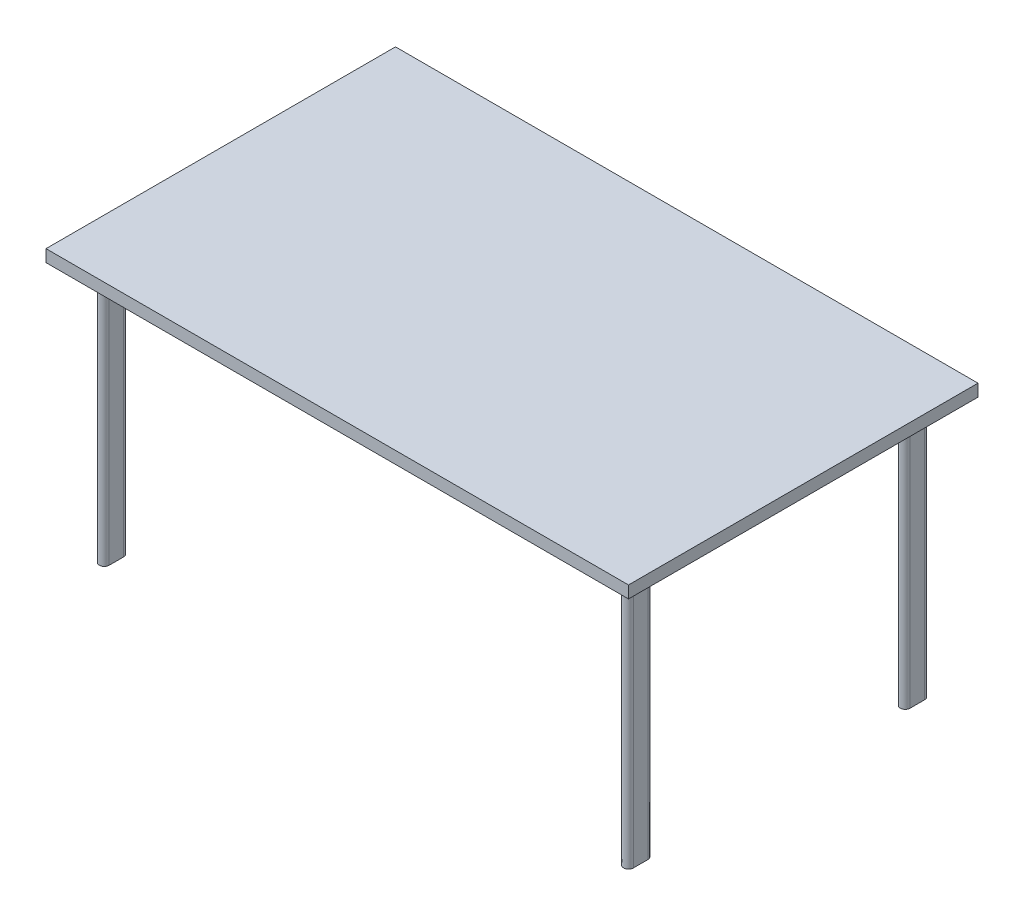
ISO-10303-21;
HEADER;
FILE_DESCRIPTION(('STEP AP214'),'2;1');
FILE_NAME('part.step','',(''),(''),'','','');
FILE_SCHEMA(('AUTOMOTIVE_DESIGN { 1 0 10303 214 1 1 1 1 }'));
ENDSEC;
DATA;
#1=APPLICATION_CONTEXT('core data for automotive mechanical design processes');
#2=APPLICATION_PROTOCOL_DEFINITION('international standard','automotive_design',2000,#1);
#3=PRODUCT_CONTEXT('',#1,'mechanical');
#4=PRODUCT('Part','Part','',(#3));
#5=PRODUCT_RELATED_PRODUCT_CATEGORY('part','',(#4));
#6=PRODUCT_DEFINITION_FORMATION('','',#4);
#7=PRODUCT_DEFINITION_CONTEXT('part definition',#1,'design');
#8=PRODUCT_DEFINITION('design','',#6,#7);
#9=PRODUCT_DEFINITION_SHAPE('','',#8);
#10=(LENGTH_UNIT() NAMED_UNIT(*) SI_UNIT(.MILLI.,.METRE.));
#11=(NAMED_UNIT(*) PLANE_ANGLE_UNIT() SI_UNIT($,.RADIAN.));
#12=(NAMED_UNIT(*) SI_UNIT($,.STERADIAN.) SOLID_ANGLE_UNIT());
#13=UNCERTAINTY_MEASURE_WITH_UNIT(LENGTH_MEASURE(1.E-05),#10,'distance_accuracy_value','');
#14=(GEOMETRIC_REPRESENTATION_CONTEXT(3) GLOBAL_UNCERTAINTY_ASSIGNED_CONTEXT((#13)) GLOBAL_UNIT_ASSIGNED_CONTEXT((#10,
#11,#12)) REPRESENTATION_CONTEXT('',''));
#15=CARTESIAN_POINT('',(0.,0.,0.));
#16=DIRECTION('',(0.,0.,1.));
#17=DIRECTION('',(1.,0.,0.));
#18=AXIS2_PLACEMENT_3D('',#15,#16,#17);
#19=CARTESIAN_POINT('',(762.,-31.75,-457.2));
#20=DIRECTION('',(0.,-1.,0.));
#21=DIRECTION('',(0.,0.,-1.));
#22=AXIS2_PLACEMENT_3D('',#19,#20,#21);
#23=PLANE('',#22);
#24=DIRECTION('',(0.,0.,-1.));
#25=VECTOR('',#24,1.);
#26=CARTESIAN_POINT('',(673.1,-31.75,381.));
#27=LINE('',#26,#25);
#28=CARTESIAN_POINT('',(673.1,-31.75,381.));
#29=VERTEX_POINT('',#28);
#30=CARTESIAN_POINT('',(673.1,-31.75,342.9));
#31=VERTEX_POINT('',#30);
#32=EDGE_CURVE('E200',#29,#31,#27,.T.);
#33=ORIENTED_EDGE('',*,*,#32,.F.);
#34=CARTESIAN_POINT('',(685.8,-31.75,381.));
#35=DIRECTION('',(0.,-1.,0.));
#36=DIRECTION('',(0.,0.,-1.));
#37=AXIS2_PLACEMENT_3D('',#34,#35,#36);
#38=CIRCLE('',#37,12.7);
#39=CARTESIAN_POINT('',(698.5,-31.75,381.));
#40=VERTEX_POINT('',#39);
#41=EDGE_CURVE('E197',#40,#29,#38,.T.);
#42=ORIENTED_EDGE('',*,*,#41,.F.);
#43=DIRECTION('',(0.,0.,1.));
#44=VECTOR('',#43,1.);
#45=CARTESIAN_POINT('',(698.5,-31.75,381.));
#46=LINE('',#45,#44);
#47=CARTESIAN_POINT('',(698.5,-31.75,342.9));
#48=VERTEX_POINT('',#47);
#49=EDGE_CURVE('E209',#48,#40,#46,.T.);
#50=ORIENTED_EDGE('',*,*,#49,.F.);
#51=CARTESIAN_POINT('',(685.8,-31.75,342.9));
#52=DIRECTION('',(0.,-1.,0.));
#53=DIRECTION('',(0.,0.,-1.));
#54=AXIS2_PLACEMENT_3D('',#51,#52,#53);
#55=CIRCLE('',#54,12.7);
#56=EDGE_CURVE('E217',#31,#48,#55,.T.);
#57=ORIENTED_EDGE('',*,*,#56,.F.);
#58=EDGE_LOOP('',(#33,#42,#50,#57));
#59=FACE_BOUND('',#58,.T.);
#60=DIRECTION('',(0.,0.,-1.));
#61=VECTOR('',#60,1.);
#62=CARTESIAN_POINT('',(-698.5,-31.75,-342.9));
#63=LINE('',#62,#61);
#64=CARTESIAN_POINT('',(-698.5,-31.75,-342.9));
#65=VERTEX_POINT('',#64);
#66=CARTESIAN_POINT('',(-698.5,-31.75,-381.));
#67=VERTEX_POINT('',#66);
#68=EDGE_CURVE('E271',#65,#67,#63,.T.);
#69=ORIENTED_EDGE('',*,*,#68,.F.);
#70=CARTESIAN_POINT('',(-685.8,-31.75,-342.9));
#71=DIRECTION('',(0.,-1.,0.));
#72=DIRECTION('',(0.,0.,-1.));
#73=AXIS2_PLACEMENT_3D('',#70,#71,#72);
#74=CIRCLE('',#73,12.7);
#75=CARTESIAN_POINT('',(-673.1,-31.75,-342.9));
#76=VERTEX_POINT('',#75);
#77=EDGE_CURVE('E257',#76,#65,#74,.T.);
#78=ORIENTED_EDGE('',*,*,#77,.F.);
#79=DIRECTION('',(0.,0.,1.));
#80=VECTOR('',#79,1.);
#81=CARTESIAN_POINT('',(-673.1,-31.75,-342.9));
#82=LINE('',#81,#80);
#83=CARTESIAN_POINT('',(-673.1,-31.75,-381.));
#84=VERTEX_POINT('',#83);
#85=EDGE_CURVE('E262',#84,#76,#82,.T.);
#86=ORIENTED_EDGE('',*,*,#85,.F.);
#87=CARTESIAN_POINT('',(-685.8,-31.75,-381.));
#88=DIRECTION('',(0.,-1.,0.));
#89=DIRECTION('',(0.,0.,-1.));
#90=AXIS2_PLACEMENT_3D('',#87,#88,#89);
#91=CIRCLE('',#90,12.7);
#92=EDGE_CURVE('E273',#67,#84,#91,.T.);
#93=ORIENTED_EDGE('',*,*,#92,.F.);
#94=EDGE_LOOP('',(#69,#78,#86,#93));
#95=FACE_BOUND('',#94,.T.);
#96=DIRECTION('',(0.,0.,-1.));
#97=VECTOR('',#96,1.);
#98=CARTESIAN_POINT('',(762.,-31.75,457.2));
#99=LINE('',#98,#97);
#100=CARTESIAN_POINT('',(762.,-31.75,457.2));
#101=VERTEX_POINT('',#100);
#102=CARTESIAN_POINT('',(762.,-31.75,-457.2));
#103=VERTEX_POINT('',#102);
#104=EDGE_CURVE('E287',#101,#103,#99,.T.);
#105=ORIENTED_EDGE('',*,*,#104,.F.);
#106=DIRECTION('',(1.,0.,0.));
#107=VECTOR('',#106,1.);
#108=CARTESIAN_POINT('',(-762.,-31.75,457.2));
#109=LINE('',#108,#107);
#110=CARTESIAN_POINT('',(-762.,-31.75,457.2));
#111=VERTEX_POINT('',#110);
#112=EDGE_CURVE('E297',#111,#101,#109,.T.);
#113=ORIENTED_EDGE('',*,*,#112,.F.);
#114=DIRECTION('',(0.,0.,1.));
#115=VECTOR('',#114,1.);
#116=CARTESIAN_POINT('',(-762.,-31.75,457.2));
#117=LINE('',#116,#115);
#118=CARTESIAN_POINT('',(-762.,-31.75,-457.2));
#119=VERTEX_POINT('',#118);
#120=EDGE_CURVE('E294',#119,#111,#117,.T.);
#121=ORIENTED_EDGE('',*,*,#120,.F.);
#122=DIRECTION('',(-1.,0.,0.));
#123=VECTOR('',#122,1.);
#124=CARTESIAN_POINT('',(-762.,-31.75,-457.2));
#125=LINE('',#124,#123);
#126=EDGE_CURVE('E290',#103,#119,#125,.T.);
#127=ORIENTED_EDGE('',*,*,#126,.F.);
#128=EDGE_LOOP('',(#105,#113,#121,#127));
#129=FACE_BOUND('',#128,.T.);
#130=DIRECTION('',(0.,0.,-1.));
#131=VECTOR('',#130,1.);
#132=CARTESIAN_POINT('',(-698.5,-31.75,381.));
#133=LINE('',#132,#131);
#134=CARTESIAN_POINT('',(-698.5,-31.75,381.));
#135=VERTEX_POINT('',#134);
#136=CARTESIAN_POINT('',(-698.5,-31.75,342.9));
#137=VERTEX_POINT('',#136);
#138=EDGE_CURVE('E242',#135,#137,#133,.T.);
#139=ORIENTED_EDGE('',*,*,#138,.F.);
#140=CARTESIAN_POINT('',(-685.8,-31.75,381.));
#141=DIRECTION('',(0.,-1.,0.));
#142=DIRECTION('',(0.,0.,-1.));
#143=AXIS2_PLACEMENT_3D('',#140,#141,#142);
#144=CIRCLE('',#143,12.7);
#145=CARTESIAN_POINT('',(-673.1,-31.75,381.));
#146=VERTEX_POINT('',#145);
#147=EDGE_CURVE('E228',#146,#135,#144,.T.);
#148=ORIENTED_EDGE('',*,*,#147,.F.);
#149=DIRECTION('',(0.,0.,1.));
#150=VECTOR('',#149,1.);
#151=CARTESIAN_POINT('',(-673.1,-31.75,381.));
#152=LINE('',#151,#150);
#153=CARTESIAN_POINT('',(-673.1,-31.75,342.9));
#154=VERTEX_POINT('',#153);
#155=EDGE_CURVE('E233',#154,#146,#152,.T.);
#156=ORIENTED_EDGE('',*,*,#155,.F.);
#157=CARTESIAN_POINT('',(-685.8,-31.75,342.9));
#158=DIRECTION('',(0.,-1.,0.));
#159=DIRECTION('',(0.,0.,-1.));
#160=AXIS2_PLACEMENT_3D('',#157,#158,#159);
#161=CIRCLE('',#160,12.7);
#162=EDGE_CURVE('E244',#137,#154,#161,.T.);
#163=ORIENTED_EDGE('',*,*,#162,.F.);
#164=EDGE_LOOP('',(#139,#148,#156,#163));
#165=FACE_BOUND('',#164,.T.);
#166=DIRECTION('',(0.,0.,-1.));
#167=VECTOR('',#166,1.);
#168=CARTESIAN_POINT('',(673.1,-31.75,-342.9));
#169=LINE('',#168,#167);
#170=CARTESIAN_POINT('',(673.1,-31.75,-342.9));
#171=VERTEX_POINT('',#170);
#172=CARTESIAN_POINT('',(673.1,-31.75,-381.));
#173=VERTEX_POINT('',#172);
#174=EDGE_CURVE('E589',#171,#173,#169,.T.);
#175=ORIENTED_EDGE('',*,*,#174,.F.);
#176=CARTESIAN_POINT('',(685.8,-31.75,-342.9));
#177=DIRECTION('',(0.,-1.,0.));
#178=DIRECTION('',(0.,0.,-1.));
#179=AXIS2_PLACEMENT_3D('',#176,#177,#178);
#180=CIRCLE('',#179,12.7);
#181=CARTESIAN_POINT('',(698.5,-31.75,-342.9));
#182=VERTEX_POINT('',#181);
#183=EDGE_CURVE('E195',#182,#171,#180,.T.);
#184=ORIENTED_EDGE('',*,*,#183,.F.);
#185=DIRECTION('',(0.,0.,1.));
#186=VECTOR('',#185,1.);
#187=CARTESIAN_POINT('',(698.5,-31.75,-342.9));
#188=LINE('',#187,#186);
#189=CARTESIAN_POINT('',(698.5,-31.75,-381.));
#190=VERTEX_POINT('',#189);
#191=EDGE_CURVE('E191',#190,#182,#188,.T.);
#192=ORIENTED_EDGE('',*,*,#191,.F.);
#193=CARTESIAN_POINT('',(685.8,-31.75,-381.));
#194=DIRECTION('',(0.,-1.,0.));
#195=DIRECTION('',(0.,0.,-1.));
#196=AXIS2_PLACEMENT_3D('',#193,#194,#195);
#197=CIRCLE('',#196,12.6999999999999);
#198=EDGE_CURVE('E586',#173,#190,#197,.T.);
#199=ORIENTED_EDGE('',*,*,#198,.F.);
#200=EDGE_LOOP('',(#175,#184,#192,#199));
#201=FACE_BOUND('',#200,.T.);
#202=ADVANCED_FACE('F33',(#59,#95,#129,#165,#201),#23,.T.);
#203=CARTESIAN_POINT('',(762.,-31.75,457.2));
#204=DIRECTION('',(1.,0.,0.));
#205=DIRECTION('',(0.,0.,-1.));
#206=AXIS2_PLACEMENT_3D('',#203,#204,#205);
#207=PLANE('',#206);
#208=DIRECTION('',(0.,0.,-1.));
#209=VECTOR('',#208,1.);
#210=CARTESIAN_POINT('',(762.,0.,457.2));
#211=LINE('',#210,#209);
#212=CARTESIAN_POINT('',(762.,0.,457.2));
#213=VERTEX_POINT('',#212);
#214=CARTESIAN_POINT('',(762.,0.,-457.2));
#215=VERTEX_POINT('',#214);
#216=EDGE_CURVE('E286',#213,#215,#211,.T.);
#217=ORIENTED_EDGE('',*,*,#216,.F.);
#218=DIRECTION('',(0.,1.,0.));
#219=VECTOR('',#218,1.);
#220=CARTESIAN_POINT('',(762.,-31.75,457.2));
#221=LINE('',#220,#219);
#222=EDGE_CURVE('E11',#101,#213,#221,.T.);
#223=ORIENTED_EDGE('',*,*,#222,.F.);
#224=ORIENTED_EDGE('',*,*,#104,.T.);
#225=DIRECTION('',(0.,1.,0.));
#226=VECTOR('',#225,1.);
#227=CARTESIAN_POINT('',(762.,-31.75,-457.2));
#228=LINE('',#227,#226);
#229=EDGE_CURVE('E37',#103,#215,#228,.T.);
#230=ORIENTED_EDGE('',*,*,#229,.T.);
#231=EDGE_LOOP('',(#217,#223,#224,#230));
#232=FACE_BOUND('',#231,.T.);
#233=ADVANCED_FACE('F35',(#232),#207,.T.);
#234=CARTESIAN_POINT('',(-762.,-31.75,457.2));
#235=DIRECTION('',(0.,0.,1.));
#236=DIRECTION('',(1.,0.,0.));
#237=AXIS2_PLACEMENT_3D('',#234,#235,#236);
#238=PLANE('',#237);
#239=DIRECTION('',(1.,0.,0.));
#240=VECTOR('',#239,1.);
#241=CARTESIAN_POINT('',(-762.,0.,457.2));
#242=LINE('',#241,#240);
#243=CARTESIAN_POINT('',(-762.,0.,457.2));
#244=VERTEX_POINT('',#243);
#245=EDGE_CURVE('E291',#244,#213,#242,.T.);
#246=ORIENTED_EDGE('',*,*,#245,.F.);
#247=DIRECTION('',(0.,1.,0.));
#248=VECTOR('',#247,1.);
#249=CARTESIAN_POINT('',(-762.,-31.75,457.2));
#250=LINE('',#249,#248);
#251=EDGE_CURVE('E42',#111,#244,#250,.T.);
#252=ORIENTED_EDGE('',*,*,#251,.F.);
#253=ORIENTED_EDGE('',*,*,#112,.T.);
#254=ORIENTED_EDGE('',*,*,#222,.T.);
#255=EDGE_LOOP('',(#246,#252,#253,#254));
#256=FACE_BOUND('',#255,.T.);
#257=ADVANCED_FACE('F323',(#256),#238,.T.);
#258=CARTESIAN_POINT('',(-762.,-31.75,457.2));
#259=DIRECTION('',(-1.,0.,0.));
#260=DIRECTION('',(0.,0.,1.));
#261=AXIS2_PLACEMENT_3D('',#258,#259,#260);
#262=PLANE('',#261);
#263=DIRECTION('',(0.,0.,1.));
#264=VECTOR('',#263,1.);
#265=CARTESIAN_POINT('',(-762.,0.,457.2));
#266=LINE('',#265,#264);
#267=CARTESIAN_POINT('',(-762.,0.,-457.2));
#268=VERTEX_POINT('',#267);
#269=EDGE_CURVE('E305',#268,#244,#266,.T.);
#270=ORIENTED_EDGE('',*,*,#269,.F.);
#271=DIRECTION('',(0.,1.,0.));
#272=VECTOR('',#271,1.);
#273=CARTESIAN_POINT('',(-762.,-31.75,-457.2));
#274=LINE('',#273,#272);
#275=EDGE_CURVE('E310',#119,#268,#274,.T.);
#276=ORIENTED_EDGE('',*,*,#275,.F.);
#277=ORIENTED_EDGE('',*,*,#120,.T.);
#278=ORIENTED_EDGE('',*,*,#251,.T.);
#279=EDGE_LOOP('',(#270,#276,#277,#278));
#280=FACE_BOUND('',#279,.T.);
#281=ADVANCED_FACE('F329',(#280),#262,.T.);
#282=CARTESIAN_POINT('',(-762.,-31.75,-457.2));
#283=DIRECTION('',(0.,0.,-1.));
#284=DIRECTION('',(-1.,0.,0.));
#285=AXIS2_PLACEMENT_3D('',#282,#283,#284);
#286=PLANE('',#285);
#287=DIRECTION('',(-1.,0.,0.));
#288=VECTOR('',#287,1.);
#289=CARTESIAN_POINT('',(-762.,0.,-457.2));
#290=LINE('',#289,#288);
#291=EDGE_CURVE('E302',#215,#268,#290,.T.);
#292=ORIENTED_EDGE('',*,*,#291,.F.);
#293=ORIENTED_EDGE('',*,*,#229,.F.);
#294=ORIENTED_EDGE('',*,*,#126,.T.);
#295=ORIENTED_EDGE('',*,*,#275,.T.);
#296=EDGE_LOOP('',(#292,#293,#294,#295));
#297=FACE_BOUND('',#296,.T.);
#298=ADVANCED_FACE('F318',(#297),#286,.T.);
#299=CARTESIAN_POINT('',(762.,0.,-457.2));
#300=DIRECTION('',(0.,-1.,0.));
#301=DIRECTION('',(0.,0.,-1.));
#302=AXIS2_PLACEMENT_3D('',#299,#300,#301);
#303=PLANE('',#302);
#304=ORIENTED_EDGE('',*,*,#216,.T.);
#305=ORIENTED_EDGE('',*,*,#291,.T.);
#306=ORIENTED_EDGE('',*,*,#269,.T.);
#307=ORIENTED_EDGE('',*,*,#245,.T.);
#308=EDGE_LOOP('',(#304,#305,#306,#307));
#309=FACE_BOUND('',#308,.T.);
#310=ADVANCED_FACE('F320',(#309),#303,.F.);
#311=CARTESIAN_POINT('',(-685.8,-711.2,-342.9));
#312=DIRECTION('',(0.,1.,0.));
#313=DIRECTION('',(0.,0.,1.));
#314=AXIS2_PLACEMENT_3D('',#311,#312,#313);
#315=CYLINDRICAL_SURFACE('',#314,12.7);
#316=ORIENTED_EDGE('',*,*,#77,.T.);
#317=DIRECTION('',(0.,1.,0.));
#318=VECTOR('',#317,1.);
#319=CARTESIAN_POINT('',(-698.5,-711.2,-342.9));
#320=LINE('',#319,#318);
#321=CARTESIAN_POINT('',(-698.5,-711.2,-342.9));
#322=VERTEX_POINT('',#321);
#323=EDGE_CURVE('E284',#322,#65,#320,.T.);
#324=ORIENTED_EDGE('',*,*,#323,.F.);
#325=CARTESIAN_POINT('',(-685.8,-711.2,-342.9));
#326=DIRECTION('',(0.,-1.,0.));
#327=DIRECTION('',(0.,0.,-1.));
#328=AXIS2_PLACEMENT_3D('',#325,#326,#327);
#329=CIRCLE('',#328,12.7);
#330=CARTESIAN_POINT('',(-673.1,-711.2,-342.9));
#331=VERTEX_POINT('',#330);
#332=EDGE_CURVE('E258',#331,#322,#329,.T.);
#333=ORIENTED_EDGE('',*,*,#332,.F.);
#334=DIRECTION('',(0.,1.,0.));
#335=VECTOR('',#334,1.);
#336=CARTESIAN_POINT('',(-673.1,-711.2,-342.9));
#337=LINE('',#336,#335);
#338=EDGE_CURVE('E268',#331,#76,#337,.T.);
#339=ORIENTED_EDGE('',*,*,#338,.T.);
#340=EDGE_LOOP('',(#316,#324,#333,#339));
#341=FACE_BOUND('',#340,.T.);
#342=ADVANCED_FACE('F347',(#341),#315,.T.);
#343=CARTESIAN_POINT('',(-698.5,-711.2,-342.9));
#344=DIRECTION('',(1.,0.,0.));
#345=DIRECTION('',(0.,0.,-1.));
#346=AXIS2_PLACEMENT_3D('',#343,#344,#345);
#347=PLANE('',#346);
#348=ORIENTED_EDGE('',*,*,#68,.T.);
#349=DIRECTION('',(0.,1.,0.));
#350=VECTOR('',#349,1.);
#351=CARTESIAN_POINT('',(-698.5,-711.2,-381.));
#352=LINE('',#351,#350);
#353=CARTESIAN_POINT('',(-698.5,-711.2,-381.));
#354=VERTEX_POINT('',#353);
#355=EDGE_CURVE('E281',#354,#67,#352,.T.);
#356=ORIENTED_EDGE('',*,*,#355,.F.);
#357=DIRECTION('',(0.,0.,-1.));
#358=VECTOR('',#357,1.);
#359=CARTESIAN_POINT('',(-698.5,-711.2,-342.9));
#360=LINE('',#359,#358);
#361=EDGE_CURVE('E261',#322,#354,#360,.T.);
#362=ORIENTED_EDGE('',*,*,#361,.F.);
#363=ORIENTED_EDGE('',*,*,#323,.T.);
#364=EDGE_LOOP('',(#348,#356,#362,#363));
#365=FACE_BOUND('',#364,.T.);
#366=ADVANCED_FACE('F353',(#365),#347,.F.);
#367=CARTESIAN_POINT('',(-685.8,-711.2,-381.));
#368=DIRECTION('',(0.,1.,0.));
#369=DIRECTION('',(0.,0.,1.));
#370=AXIS2_PLACEMENT_3D('',#367,#368,#369);
#371=CYLINDRICAL_SURFACE('',#370,12.7);
#372=ORIENTED_EDGE('',*,*,#92,.T.);
#373=DIRECTION('',(0.,1.,0.));
#374=VECTOR('',#373,1.);
#375=CARTESIAN_POINT('',(-673.1,-711.2,-381.));
#376=LINE('',#375,#374);
#377=CARTESIAN_POINT('',(-673.1,-711.2,-381.));
#378=VERTEX_POINT('',#377);
#379=EDGE_CURVE('E279',#378,#84,#376,.T.);
#380=ORIENTED_EDGE('',*,*,#379,.F.);
#381=CARTESIAN_POINT('',(-685.8,-711.2,-381.));
#382=DIRECTION('',(0.,-1.,0.));
#383=DIRECTION('',(0.,0.,-1.));
#384=AXIS2_PLACEMENT_3D('',#381,#382,#383);
#385=CIRCLE('',#384,12.7);
#386=EDGE_CURVE('E264',#354,#378,#385,.T.);
#387=ORIENTED_EDGE('',*,*,#386,.F.);
#388=ORIENTED_EDGE('',*,*,#355,.T.);
#389=EDGE_LOOP('',(#372,#380,#387,#388));
#390=FACE_BOUND('',#389,.T.);
#391=ADVANCED_FACE('F358',(#390),#371,.T.);
#392=CARTESIAN_POINT('',(-673.1,-711.2,-342.9));
#393=DIRECTION('',(-1.,0.,0.));
#394=DIRECTION('',(0.,0.,1.));
#395=AXIS2_PLACEMENT_3D('',#392,#393,#394);
#396=PLANE('',#395);
#397=ORIENTED_EDGE('',*,*,#85,.T.);
#398=ORIENTED_EDGE('',*,*,#338,.F.);
#399=DIRECTION('',(0.,0.,1.));
#400=VECTOR('',#399,1.);
#401=CARTESIAN_POINT('',(-673.1,-711.2,-342.9));
#402=LINE('',#401,#400);
#403=EDGE_CURVE('E266',#378,#331,#402,.T.);
#404=ORIENTED_EDGE('',*,*,#403,.F.);
#405=ORIENTED_EDGE('',*,*,#379,.T.);
#406=EDGE_LOOP('',(#397,#398,#404,#405));
#407=FACE_BOUND('',#406,.T.);
#408=ADVANCED_FACE('F375',(#407),#396,.F.);
#409=CARTESIAN_POINT('',(-685.8,-711.2,-342.9));
#410=DIRECTION('',(0.,-1.,0.));
#411=DIRECTION('',(0.,0.,-1.));
#412=AXIS2_PLACEMENT_3D('',#409,#410,#411);
#413=PLANE('',#412);
#414=ORIENTED_EDGE('',*,*,#332,.T.);
#415=ORIENTED_EDGE('',*,*,#361,.T.);
#416=ORIENTED_EDGE('',*,*,#386,.T.);
#417=ORIENTED_EDGE('',*,*,#403,.T.);
#418=EDGE_LOOP('',(#414,#415,#416,#417));
#419=FACE_BOUND('',#418,.T.);
#420=ADVANCED_FACE('F373',(#419),#413,.T.);
#421=CARTESIAN_POINT('',(-685.8,-711.2,381.));
#422=DIRECTION('',(0.,1.,0.));
#423=DIRECTION('',(0.,0.,1.));
#424=AXIS2_PLACEMENT_3D('',#421,#422,#423);
#425=CYLINDRICAL_SURFACE('',#424,12.7);
#426=ORIENTED_EDGE('',*,*,#147,.T.);
#427=DIRECTION('',(0.,1.,0.));
#428=VECTOR('',#427,1.);
#429=CARTESIAN_POINT('',(-698.5,-711.2,381.));
#430=LINE('',#429,#428);
#431=CARTESIAN_POINT('',(-698.5,-711.2,381.));
#432=VERTEX_POINT('',#431);
#433=EDGE_CURVE('E255',#432,#135,#430,.T.);
#434=ORIENTED_EDGE('',*,*,#433,.F.);
#435=CARTESIAN_POINT('',(-685.8,-711.2,381.));
#436=DIRECTION('',(0.,-1.,0.));
#437=DIRECTION('',(0.,0.,-1.));
#438=AXIS2_PLACEMENT_3D('',#435,#436,#437);
#439=CIRCLE('',#438,12.7);
#440=CARTESIAN_POINT('',(-673.1,-711.2,381.));
#441=VERTEX_POINT('',#440);
#442=EDGE_CURVE('E229',#441,#432,#439,.T.);
#443=ORIENTED_EDGE('',*,*,#442,.F.);
#444=DIRECTION('',(0.,1.,0.));
#445=VECTOR('',#444,1.);
#446=CARTESIAN_POINT('',(-673.1,-711.2,381.));
#447=LINE('',#446,#445);
#448=EDGE_CURVE('E239',#441,#146,#447,.T.);
#449=ORIENTED_EDGE('',*,*,#448,.T.);
#450=EDGE_LOOP('',(#426,#434,#443,#449));
#451=FACE_BOUND('',#450,.T.);
#452=ADVANCED_FACE('F382',(#451),#425,.T.);
#453=CARTESIAN_POINT('',(-698.5,-711.2,381.));
#454=DIRECTION('',(1.,0.,0.));
#455=DIRECTION('',(0.,0.,-1.));
#456=AXIS2_PLACEMENT_3D('',#453,#454,#455);
#457=PLANE('',#456);
#458=ORIENTED_EDGE('',*,*,#138,.T.);
#459=DIRECTION('',(0.,1.,0.));
#460=VECTOR('',#459,1.);
#461=CARTESIAN_POINT('',(-698.5,-711.2,342.9));
#462=LINE('',#461,#460);
#463=CARTESIAN_POINT('',(-698.5,-711.2,342.9));
#464=VERTEX_POINT('',#463);
#465=EDGE_CURVE('E252',#464,#137,#462,.T.);
#466=ORIENTED_EDGE('',*,*,#465,.F.);
#467=DIRECTION('',(0.,0.,-1.));
#468=VECTOR('',#467,1.);
#469=CARTESIAN_POINT('',(-698.5,-711.2,381.));
#470=LINE('',#469,#468);
#471=EDGE_CURVE('E232',#432,#464,#470,.T.);
#472=ORIENTED_EDGE('',*,*,#471,.F.);
#473=ORIENTED_EDGE('',*,*,#433,.T.);
#474=EDGE_LOOP('',(#458,#466,#472,#473));
#475=FACE_BOUND('',#474,.T.);
#476=ADVANCED_FACE('F388',(#475),#457,.F.);
#477=CARTESIAN_POINT('',(-685.8,-711.2,342.9));
#478=DIRECTION('',(0.,1.,0.));
#479=DIRECTION('',(0.,0.,1.));
#480=AXIS2_PLACEMENT_3D('',#477,#478,#479);
#481=CYLINDRICAL_SURFACE('',#480,12.7);
#482=ORIENTED_EDGE('',*,*,#162,.T.);
#483=DIRECTION('',(0.,1.,0.));
#484=VECTOR('',#483,1.);
#485=CARTESIAN_POINT('',(-673.1,-711.2,342.9));
#486=LINE('',#485,#484);
#487=CARTESIAN_POINT('',(-673.1,-711.2,342.9));
#488=VERTEX_POINT('',#487);
#489=EDGE_CURVE('E250',#488,#154,#486,.T.);
#490=ORIENTED_EDGE('',*,*,#489,.F.);
#491=CARTESIAN_POINT('',(-685.8,-711.2,342.9));
#492=DIRECTION('',(0.,-1.,0.));
#493=DIRECTION('',(0.,0.,-1.));
#494=AXIS2_PLACEMENT_3D('',#491,#492,#493);
#495=CIRCLE('',#494,12.7);
#496=EDGE_CURVE('E235',#464,#488,#495,.T.);
#497=ORIENTED_EDGE('',*,*,#496,.F.);
#498=ORIENTED_EDGE('',*,*,#465,.T.);
#499=EDGE_LOOP('',(#482,#490,#497,#498));
#500=FACE_BOUND('',#499,.T.);
#501=ADVANCED_FACE('F392',(#500),#481,.T.);
#502=CARTESIAN_POINT('',(-673.1,-711.2,381.));
#503=DIRECTION('',(-1.,0.,0.));
#504=DIRECTION('',(0.,0.,1.));
#505=AXIS2_PLACEMENT_3D('',#502,#503,#504);
#506=PLANE('',#505);
#507=ORIENTED_EDGE('',*,*,#155,.T.);
#508=ORIENTED_EDGE('',*,*,#448,.F.);
#509=DIRECTION('',(0.,0.,1.));
#510=VECTOR('',#509,1.);
#511=CARTESIAN_POINT('',(-673.1,-711.2,381.));
#512=LINE('',#511,#510);
#513=EDGE_CURVE('E237',#488,#441,#512,.T.);
#514=ORIENTED_EDGE('',*,*,#513,.F.);
#515=ORIENTED_EDGE('',*,*,#489,.T.);
#516=EDGE_LOOP('',(#507,#508,#514,#515));
#517=FACE_BOUND('',#516,.T.);
#518=ADVANCED_FACE('F396',(#517),#506,.F.);
#519=CARTESIAN_POINT('',(-685.8,-711.2,381.));
#520=DIRECTION('',(0.,-1.,0.));
#521=DIRECTION('',(0.,0.,-1.));
#522=AXIS2_PLACEMENT_3D('',#519,#520,#521);
#523=PLANE('',#522);
#524=ORIENTED_EDGE('',*,*,#442,.T.);
#525=ORIENTED_EDGE('',*,*,#471,.T.);
#526=ORIENTED_EDGE('',*,*,#496,.T.);
#527=ORIENTED_EDGE('',*,*,#513,.T.);
#528=EDGE_LOOP('',(#524,#525,#526,#527));
#529=FACE_BOUND('',#528,.T.);
#530=ADVANCED_FACE('F400',(#529),#523,.T.);
#531=CARTESIAN_POINT('',(685.8,-711.2,381.));
#532=DIRECTION('',(0.,1.,0.));
#533=DIRECTION('',(0.,0.,1.));
#534=AXIS2_PLACEMENT_3D('',#531,#532,#533);
#535=CYLINDRICAL_SURFACE('',#534,12.7);
#536=ORIENTED_EDGE('',*,*,#41,.T.);
#537=DIRECTION('',(0.,1.,0.));
#538=VECTOR('',#537,1.);
#539=CARTESIAN_POINT('',(673.1,-711.2,381.));
#540=LINE('',#539,#538);
#541=CARTESIAN_POINT('',(673.1,-711.2,381.));
#542=VERTEX_POINT('',#541);
#543=EDGE_CURVE('E226',#542,#29,#540,.T.);
#544=ORIENTED_EDGE('',*,*,#543,.F.);
#545=CARTESIAN_POINT('',(685.8,-711.2,381.));
#546=DIRECTION('',(0.,-1.,0.));
#547=DIRECTION('',(0.,0.,-1.));
#548=AXIS2_PLACEMENT_3D('',#545,#546,#547);
#549=CIRCLE('',#548,12.7);
#550=CARTESIAN_POINT('',(698.5,-711.2,381.));
#551=VERTEX_POINT('',#550);
#552=EDGE_CURVE('E205',#551,#542,#549,.T.);
#553=ORIENTED_EDGE('',*,*,#552,.F.);
#554=DIRECTION('',(0.,1.,0.));
#555=VECTOR('',#554,1.);
#556=CARTESIAN_POINT('',(698.5,-711.2,381.));
#557=LINE('',#556,#555);
#558=EDGE_CURVE('E214',#551,#40,#557,.T.);
#559=ORIENTED_EDGE('',*,*,#558,.T.);
#560=EDGE_LOOP('',(#536,#544,#553,#559));
#561=FACE_BOUND('',#560,.T.);
#562=ADVANCED_FACE('F404',(#561),#535,.T.);
#563=CARTESIAN_POINT('',(673.1,-711.2,381.));
#564=DIRECTION('',(1.,0.,0.));
#565=DIRECTION('',(0.,0.,-1.));
#566=AXIS2_PLACEMENT_3D('',#563,#564,#565);
#567=PLANE('',#566);
#568=ORIENTED_EDGE('',*,*,#32,.T.);
#569=DIRECTION('',(0.,1.,0.));
#570=VECTOR('',#569,1.);
#571=CARTESIAN_POINT('',(673.1,-711.2,342.9));
#572=LINE('',#571,#570);
#573=CARTESIAN_POINT('',(673.1,-711.2,342.9));
#574=VERTEX_POINT('',#573);
#575=EDGE_CURVE('E223',#574,#31,#572,.T.);
#576=ORIENTED_EDGE('',*,*,#575,.F.);
#577=DIRECTION('',(0.,0.,-1.));
#578=VECTOR('',#577,1.);
#579=CARTESIAN_POINT('',(673.1,-711.2,381.));
#580=LINE('',#579,#578);
#581=EDGE_CURVE('E208',#542,#574,#580,.T.);
#582=ORIENTED_EDGE('',*,*,#581,.F.);
#583=ORIENTED_EDGE('',*,*,#543,.T.);
#584=EDGE_LOOP('',(#568,#576,#582,#583));
#585=FACE_BOUND('',#584,.T.);
#586=ADVANCED_FACE('F408',(#585),#567,.F.);
#587=CARTESIAN_POINT('',(685.8,-711.2,342.9));
#588=DIRECTION('',(0.,1.,0.));
#589=DIRECTION('',(0.,0.,1.));
#590=AXIS2_PLACEMENT_3D('',#587,#588,#589);
#591=CYLINDRICAL_SURFACE('',#590,12.7);
#592=ORIENTED_EDGE('',*,*,#56,.T.);
#593=DIRECTION('',(0.,1.,0.));
#594=VECTOR('',#593,1.);
#595=CARTESIAN_POINT('',(698.5,-711.2,342.9));
#596=LINE('',#595,#594);
#597=CARTESIAN_POINT('',(698.5,-711.2,342.9));
#598=VERTEX_POINT('',#597);
#599=EDGE_CURVE('E58',#598,#48,#596,.T.);
#600=ORIENTED_EDGE('',*,*,#599,.F.);
#601=CARTESIAN_POINT('',(685.8,-711.2,342.9));
#602=DIRECTION('',(0.,-1.,0.));
#603=DIRECTION('',(0.,0.,-1.));
#604=AXIS2_PLACEMENT_3D('',#601,#602,#603);
#605=CIRCLE('',#604,12.7);
#606=EDGE_CURVE('E211',#574,#598,#605,.T.);
#607=ORIENTED_EDGE('',*,*,#606,.F.);
#608=ORIENTED_EDGE('',*,*,#575,.T.);
#609=EDGE_LOOP('',(#592,#600,#607,#608));
#610=FACE_BOUND('',#609,.T.);
#611=ADVANCED_FACE('F412',(#610),#591,.T.);
#612=CARTESIAN_POINT('',(698.5,-711.2,381.));
#613=DIRECTION('',(-1.,0.,0.));
#614=DIRECTION('',(0.,0.,1.));
#615=AXIS2_PLACEMENT_3D('',#612,#613,#614);
#616=PLANE('',#615);
#617=ORIENTED_EDGE('',*,*,#49,.T.);
#618=ORIENTED_EDGE('',*,*,#558,.F.);
#619=DIRECTION('',(0.,0.,1.));
#620=VECTOR('',#619,1.);
#621=CARTESIAN_POINT('',(698.5,-711.2,381.));
#622=LINE('',#621,#620);
#623=EDGE_CURVE('E213',#598,#551,#622,.T.);
#624=ORIENTED_EDGE('',*,*,#623,.F.);
#625=ORIENTED_EDGE('',*,*,#599,.T.);
#626=EDGE_LOOP('',(#617,#618,#624,#625));
#627=FACE_BOUND('',#626,.T.);
#628=ADVANCED_FACE('F416',(#627),#616,.F.);
#629=CARTESIAN_POINT('',(685.8,-711.2,381.));
#630=DIRECTION('',(0.,-1.,0.));
#631=DIRECTION('',(0.,0.,-1.));
#632=AXIS2_PLACEMENT_3D('',#629,#630,#631);
#633=PLANE('',#632);
#634=ORIENTED_EDGE('',*,*,#552,.T.);
#635=ORIENTED_EDGE('',*,*,#581,.T.);
#636=ORIENTED_EDGE('',*,*,#606,.T.);
#637=ORIENTED_EDGE('',*,*,#623,.T.);
#638=EDGE_LOOP('',(#634,#635,#636,#637));
#639=FACE_BOUND('',#638,.T.);
#640=ADVANCED_FACE('F420',(#639),#633,.T.);
#641=CARTESIAN_POINT('',(685.8,-711.2,-342.9));
#642=DIRECTION('',(0.,1.,0.));
#643=DIRECTION('',(0.,0.,1.));
#644=AXIS2_PLACEMENT_3D('',#641,#642,#643);
#645=CYLINDRICAL_SURFACE('',#644,12.7);
#646=ORIENTED_EDGE('',*,*,#183,.T.);
#647=DIRECTION('',(0.,1.,0.));
#648=VECTOR('',#647,1.);
#649=CARTESIAN_POINT('',(673.1,-711.2,-342.9));
#650=LINE('',#649,#648);
#651=CARTESIAN_POINT('',(673.1,-711.2,-342.9));
#652=VERTEX_POINT('',#651);
#653=EDGE_CURVE('E176',#652,#171,#650,.T.);
#654=ORIENTED_EDGE('',*,*,#653,.F.);
#655=CARTESIAN_POINT('',(685.8,-711.2,-342.9));
#656=DIRECTION('',(0.,-1.,0.));
#657=DIRECTION('',(0.,0.,-1.));
#658=AXIS2_PLACEMENT_3D('',#655,#656,#657);
#659=CIRCLE('',#658,12.7);
#660=CARTESIAN_POINT('',(698.5,-711.2,-342.9));
#661=VERTEX_POINT('',#660);
#662=EDGE_CURVE('E183',#661,#652,#659,.T.);
#663=ORIENTED_EDGE('',*,*,#662,.F.);
#664=DIRECTION('',(0.,1.,0.));
#665=VECTOR('',#664,1.);
#666=CARTESIAN_POINT('',(698.5,-711.2,-342.9));
#667=LINE('',#666,#665);
#668=EDGE_CURVE('E583',#661,#182,#667,.T.);
#669=ORIENTED_EDGE('',*,*,#668,.T.);
#670=EDGE_LOOP('',(#646,#654,#663,#669));
#671=FACE_BOUND('',#670,.T.);
#672=ADVANCED_FACE('F193',(#671),#645,.T.);
#673=CARTESIAN_POINT('',(673.1,-711.2,-342.9));
#674=DIRECTION('',(1.,0.,0.));
#675=DIRECTION('',(0.,0.,-1.));
#676=AXIS2_PLACEMENT_3D('',#673,#674,#675);
#677=PLANE('',#676);
#678=ORIENTED_EDGE('',*,*,#174,.T.);
#679=DIRECTION('',(0.,1.,0.));
#680=VECTOR('',#679,1.);
#681=CARTESIAN_POINT('',(673.1,-711.2,-381.));
#682=LINE('',#681,#680);
#683=CARTESIAN_POINT('',(673.1,-711.2,-381.));
#684=VERTEX_POINT('',#683);
#685=EDGE_CURVE('E179',#684,#173,#682,.T.);
#686=ORIENTED_EDGE('',*,*,#685,.F.);
#687=DIRECTION('',(0.,0.,-1.));
#688=VECTOR('',#687,1.);
#689=CARTESIAN_POINT('',(673.1,-711.2,-342.9));
#690=LINE('',#689,#688);
#691=EDGE_CURVE('E172',#652,#684,#690,.T.);
#692=ORIENTED_EDGE('',*,*,#691,.F.);
#693=ORIENTED_EDGE('',*,*,#653,.T.);
#694=EDGE_LOOP('',(#678,#686,#692,#693));
#695=FACE_BOUND('',#694,.T.);
#696=ADVANCED_FACE('F174',(#695),#677,.F.);
#697=CARTESIAN_POINT('',(685.8,-711.2,-381.));
#698=DIRECTION('',(0.,1.,0.));
#699=DIRECTION('',(0.,0.,1.));
#700=AXIS2_PLACEMENT_3D('',#697,#698,#699);
#701=CYLINDRICAL_SURFACE('',#700,12.6999999999999);
#702=ORIENTED_EDGE('',*,*,#198,.T.);
#703=DIRECTION('',(0.,1.,0.));
#704=VECTOR('',#703,1.);
#705=CARTESIAN_POINT('',(698.5,-711.2,-381.));
#706=LINE('',#705,#704);
#707=CARTESIAN_POINT('',(698.5,-711.2,-381.));
#708=VERTEX_POINT('',#707);
#709=EDGE_CURVE('E50',#708,#190,#706,.T.);
#710=ORIENTED_EDGE('',*,*,#709,.F.);
#711=CARTESIAN_POINT('',(685.8,-711.2,-381.));
#712=DIRECTION('',(0.,-1.,0.));
#713=DIRECTION('',(0.,0.,-1.));
#714=AXIS2_PLACEMENT_3D('',#711,#712,#713);
#715=CIRCLE('',#714,12.6999999999999);
#716=EDGE_CURVE('E182',#684,#708,#715,.T.);
#717=ORIENTED_EDGE('',*,*,#716,.F.);
#718=ORIENTED_EDGE('',*,*,#685,.T.);
#719=EDGE_LOOP('',(#702,#710,#717,#718));
#720=FACE_BOUND('',#719,.T.);
#721=ADVANCED_FACE('F428',(#720),#701,.T.);
#722=CARTESIAN_POINT('',(698.5,-711.2,-342.9));
#723=DIRECTION('',(-1.,0.,0.));
#724=DIRECTION('',(0.,0.,1.));
#725=AXIS2_PLACEMENT_3D('',#722,#723,#724);
#726=PLANE('',#725);
#727=ORIENTED_EDGE('',*,*,#191,.T.);
#728=ORIENTED_EDGE('',*,*,#668,.F.);
#729=DIRECTION('',(0.,0.,1.));
#730=VECTOR('',#729,1.);
#731=CARTESIAN_POINT('',(698.5,-711.2,-342.9));
#732=LINE('',#731,#730);
#733=EDGE_CURVE('E187',#708,#661,#732,.T.);
#734=ORIENTED_EDGE('',*,*,#733,.F.);
#735=ORIENTED_EDGE('',*,*,#709,.T.);
#736=EDGE_LOOP('',(#727,#728,#734,#735));
#737=FACE_BOUND('',#736,.T.);
#738=ADVANCED_FACE('F431',(#737),#726,.F.);
#739=CARTESIAN_POINT('',(685.8,-711.2,-342.9));
#740=DIRECTION('',(0.,-1.,0.));
#741=DIRECTION('',(0.,0.,-1.));
#742=AXIS2_PLACEMENT_3D('',#739,#740,#741);
#743=PLANE('',#742);
#744=ORIENTED_EDGE('',*,*,#662,.T.);
#745=ORIENTED_EDGE('',*,*,#691,.T.);
#746=ORIENTED_EDGE('',*,*,#716,.T.);
#747=ORIENTED_EDGE('',*,*,#733,.T.);
#748=EDGE_LOOP('',(#744,#745,#746,#747));
#749=FACE_BOUND('',#748,.T.);
#750=ADVANCED_FACE('F186',(#749),#743,.T.);
#751=CLOSED_SHELL('',(#202,#233,#257,#281,#298,#310,#342,#366,#391,#408,#420,#452,#476,#501,
#518,#530,#562,#586,#611,#628,#640,#672,#696,#721,#738,#750));
#752=MANIFOLD_SOLID_BREP('B2',#751);
#753=ADVANCED_BREP_SHAPE_REPRESENTATION('',(#18,#752),#14);
#754=SHAPE_DEFINITION_REPRESENTATION(#9,#753);
ENDSEC;
END-ISO-10303-21;
